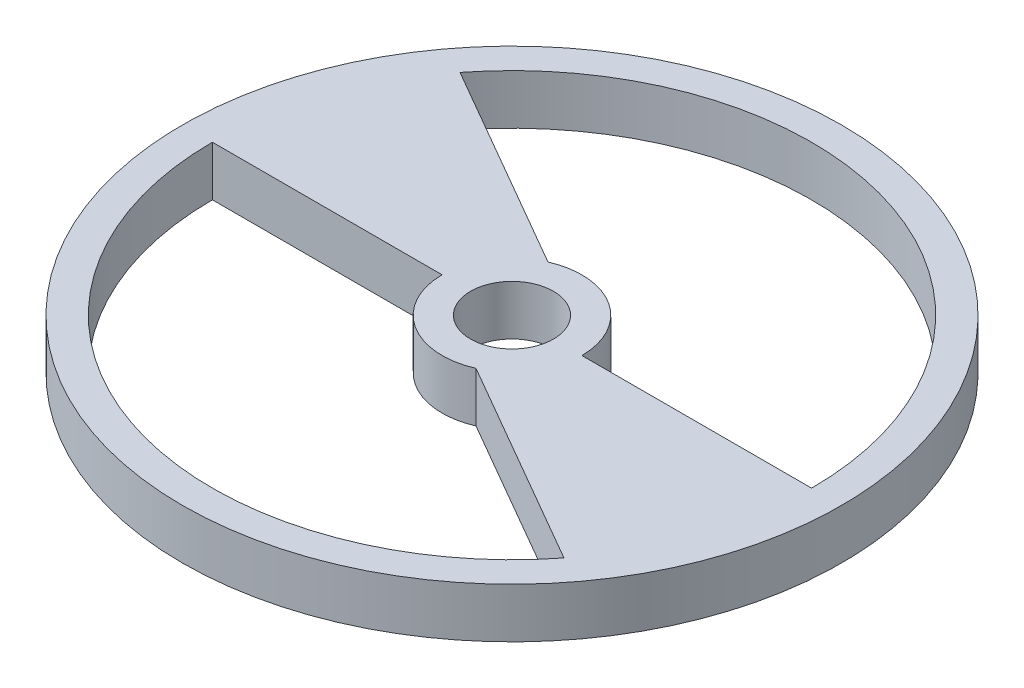
ISO-10303-21;
HEADER;
FILE_DESCRIPTION(('STEP AP214'),'2;1');
FILE_NAME('part.step','',(''),(''),'','','');
FILE_SCHEMA(('AUTOMOTIVE_DESIGN { 1 0 10303 214 1 1 1 1 }'));
ENDSEC;
DATA;
#1=APPLICATION_CONTEXT('core data for automotive mechanical design processes');
#2=APPLICATION_PROTOCOL_DEFINITION('international standard','automotive_design',2000,#1);
#3=PRODUCT_CONTEXT('',#1,'mechanical');
#4=PRODUCT('Part','Part','',(#3));
#5=PRODUCT_RELATED_PRODUCT_CATEGORY('part','',(#4));
#6=PRODUCT_DEFINITION_FORMATION('','',#4);
#7=PRODUCT_DEFINITION_CONTEXT('part definition',#1,'design');
#8=PRODUCT_DEFINITION('design','',#6,#7);
#9=PRODUCT_DEFINITION_SHAPE('','',#8);
#10=(LENGTH_UNIT() NAMED_UNIT(*) SI_UNIT(.MILLI.,.METRE.));
#11=(NAMED_UNIT(*) PLANE_ANGLE_UNIT() SI_UNIT($,.RADIAN.));
#12=(NAMED_UNIT(*) SI_UNIT($,.STERADIAN.) SOLID_ANGLE_UNIT());
#13=UNCERTAINTY_MEASURE_WITH_UNIT(LENGTH_MEASURE(1.E-05),#10,'distance_accuracy_value','');
#14=(GEOMETRIC_REPRESENTATION_CONTEXT(3) GLOBAL_UNCERTAINTY_ASSIGNED_CONTEXT((#13)) GLOBAL_UNIT_ASSIGNED_CONTEXT((#10,
#11,#12)) REPRESENTATION_CONTEXT('',''));
#15=CARTESIAN_POINT('',(0.,0.,0.));
#16=DIRECTION('',(0.,0.,1.));
#17=DIRECTION('',(1.,0.,0.));
#18=AXIS2_PLACEMENT_3D('',#15,#16,#17);
#19=CARTESIAN_POINT('',(0.,2.5,0.));
#20=DIRECTION('',(0.,1.,0.));
#21=DIRECTION('',(0.,0.,1.));
#22=AXIS2_PLACEMENT_3D('',#19,#20,#21);
#23=PLANE('',#22);
#24=CARTESIAN_POINT('',(0.,2.5,0.));
#25=DIRECTION('',(0.,1.,0.));
#26=DIRECTION('',(0.,0.,1.));
#27=AXIS2_PLACEMENT_3D('',#24,#25,#26);
#28=CIRCLE('',#27,16.5);
#29=CARTESIAN_POINT('',(0.,2.5,16.5));
#30=VERTEX_POINT('',#29);
#31=EDGE_CURVE('E11',#30,#30,#28,.T.);
#32=ORIENTED_EDGE('',*,*,#31,.T.);
#33=EDGE_LOOP('',(#32));
#34=FACE_BOUND('',#33,.T.);
#35=CARTESIAN_POINT('',(0.,2.5,0.));
#36=DIRECTION('',(0.,1.,0.));
#37=DIRECTION('',(0.,0.,1.));
#38=AXIS2_PLACEMENT_3D('',#35,#36,#37);
#39=CIRCLE('',#38,2.075);
#40=CARTESIAN_POINT('',(0.,2.5,2.075));
#41=VERTEX_POINT('',#40);
#42=EDGE_CURVE('E171',#41,#41,#39,.T.);
#43=ORIENTED_EDGE('',*,*,#42,.F.);
#44=EDGE_LOOP('',(#43));
#45=FACE_BOUND('',#44,.T.);
#46=DIRECTION('',(-1.,0.,0.));
#47=VECTOR('',#46,1.);
#48=CARTESIAN_POINT('',(-3.5,2.5,0.));
#49=LINE('',#48,#47);
#50=CARTESIAN_POINT('',(-3.5,2.5,0.));
#51=VERTEX_POINT('',#50);
#52=CARTESIAN_POINT('',(-15.,2.5,0.));
#53=VERTEX_POINT('',#52);
#54=EDGE_CURVE('E142',#51,#53,#49,.T.);
#55=ORIENTED_EDGE('',*,*,#54,.F.);
#56=CARTESIAN_POINT('',(0.,2.5,0.));
#57=DIRECTION('',(0.,-1.,0.));
#58=DIRECTION('',(0.,0.,1.));
#59=AXIS2_PLACEMENT_3D('',#56,#57,#58);
#60=CIRCLE('',#59,3.5);
#61=CARTESIAN_POINT('',(1.40345908404872,2.5,3.20629109710911));
#62=VERTEX_POINT('',#61);
#63=EDGE_CURVE('E140',#62,#51,#60,.T.);
#64=ORIENTED_EDGE('',*,*,#63,.F.);
#65=DIRECTION('',(-0.866025403784438,0.,-0.500000000000001));
#66=VECTOR('',#65,1.);
#67=CARTESIAN_POINT('',(1.40345908404872,2.5,3.20629109710911));
#68=LINE('',#67,#66);
#69=CARTESIAN_POINT('',(11.8279879911335,2.5,9.22489566778954));
#70=VERTEX_POINT('',#69);
#71=EDGE_CURVE('E148',#70,#62,#68,.T.);
#72=ORIENTED_EDGE('',*,*,#71,.F.);
#73=CARTESIAN_POINT('',(0.,2.5,0.));
#74=DIRECTION('',(0.,1.,0.));
#75=DIRECTION('',(0.,0.,1.));
#76=AXIS2_PLACEMENT_3D('',#73,#74,#75);
#77=CIRCLE('',#76,15.);
#78=EDGE_CURVE('E145',#53,#70,#77,.T.);
#79=ORIENTED_EDGE('',*,*,#78,.F.);
#80=EDGE_LOOP('',(#55,#64,#72,#79));
#81=FACE_BOUND('',#80,.T.);
#82=DIRECTION('',(0.866025403784442,0.,0.499999999999995));
#83=VECTOR('',#82,1.);
#84=CARTESIAN_POINT('',(-11.8279879911335,2.5,-9.22489566778945));
#85=LINE('',#84,#83);
#86=CARTESIAN_POINT('',(-11.8279879911335,2.5,-9.22489566778945));
#87=VERTEX_POINT('',#86);
#88=CARTESIAN_POINT('',(-1.40345908404875,2.5,-3.2062910971091));
#89=VERTEX_POINT('',#88);
#90=EDGE_CURVE('E112',#87,#89,#85,.T.);
#91=ORIENTED_EDGE('',*,*,#90,.F.);
#92=CARTESIAN_POINT('',(0.,2.5,0.));
#93=DIRECTION('',(0.,1.,0.));
#94=DIRECTION('',(0.,0.,1.));
#95=AXIS2_PLACEMENT_3D('',#92,#93,#94);
#96=CIRCLE('',#95,15.);
#97=CARTESIAN_POINT('',(15.,2.5,0.));
#98=VERTEX_POINT('',#97);
#99=EDGE_CURVE('E104',#98,#87,#96,.T.);
#100=ORIENTED_EDGE('',*,*,#99,.F.);
#101=DIRECTION('',(1.,0.,0.));
#102=VECTOR('',#101,1.);
#103=CARTESIAN_POINT('',(3.5,2.5,0.));
#104=LINE('',#103,#102);
#105=CARTESIAN_POINT('',(3.5,2.5,0.));
#106=VERTEX_POINT('',#105);
#107=EDGE_CURVE('E126',#106,#98,#104,.T.);
#108=ORIENTED_EDGE('',*,*,#107,.F.);
#109=CARTESIAN_POINT('',(0.,2.5,0.));
#110=DIRECTION('',(0.,-1.,0.));
#111=DIRECTION('',(0.,0.,1.));
#112=AXIS2_PLACEMENT_3D('',#109,#110,#111);
#113=CIRCLE('',#112,3.5);
#114=EDGE_CURVE('E124',#89,#106,#113,.T.);
#115=ORIENTED_EDGE('',*,*,#114,.F.);
#116=EDGE_LOOP('',(#91,#100,#108,#115));
#117=FACE_BOUND('',#116,.T.);
#118=ADVANCED_FACE('F39',(#34,#45,#81,#117),#23,.T.);
#119=CARTESIAN_POINT('',(0.,0.,0.));
#120=DIRECTION('',(0.,1.,0.));
#121=DIRECTION('',(0.,0.,1.));
#122=AXIS2_PLACEMENT_3D('',#119,#120,#121);
#123=PLANE('',#122);
#124=CARTESIAN_POINT('',(0.,0.,0.));
#125=DIRECTION('',(0.,-1.,0.));
#126=DIRECTION('',(0.,0.,1.));
#127=AXIS2_PLACEMENT_3D('',#124,#125,#126);
#128=CIRCLE('',#127,3.5);
#129=CARTESIAN_POINT('',(1.40345908404872,0.,3.20629109710911));
#130=VERTEX_POINT('',#129);
#131=CARTESIAN_POINT('',(-3.5,0.,0.));
#132=VERTEX_POINT('',#131);
#133=EDGE_CURVE('E120',#130,#132,#128,.T.);
#134=ORIENTED_EDGE('',*,*,#133,.T.);
#135=DIRECTION('',(-1.,0.,0.));
#136=VECTOR('',#135,1.);
#137=CARTESIAN_POINT('',(-3.5,0.,0.));
#138=LINE('',#137,#136);
#139=CARTESIAN_POINT('',(-15.,0.,0.));
#140=VERTEX_POINT('',#139);
#141=EDGE_CURVE('E153',#132,#140,#138,.T.);
#142=ORIENTED_EDGE('',*,*,#141,.T.);
#143=CARTESIAN_POINT('',(0.,0.,0.));
#144=DIRECTION('',(0.,1.,0.));
#145=DIRECTION('',(0.,0.,1.));
#146=AXIS2_PLACEMENT_3D('',#143,#144,#145);
#147=CIRCLE('',#146,15.);
#148=CARTESIAN_POINT('',(11.8279879911335,0.,9.22489566778954));
#149=VERTEX_POINT('',#148);
#150=EDGE_CURVE('E156',#140,#149,#147,.T.);
#151=ORIENTED_EDGE('',*,*,#150,.T.);
#152=DIRECTION('',(-0.866025403784438,0.,-0.500000000000001));
#153=VECTOR('',#152,1.);
#154=CARTESIAN_POINT('',(1.40345908404872,0.,3.20629109710911));
#155=LINE('',#154,#153);
#156=EDGE_CURVE('E143',#149,#130,#155,.T.);
#157=ORIENTED_EDGE('',*,*,#156,.T.);
#158=EDGE_LOOP('',(#134,#142,#151,#157));
#159=FACE_BOUND('',#158,.T.);
#160=CARTESIAN_POINT('',(0.,0.,0.));
#161=DIRECTION('',(0.,1.,0.));
#162=DIRECTION('',(0.,0.,1.));
#163=AXIS2_PLACEMENT_3D('',#160,#161,#162);
#164=CIRCLE('',#163,16.5);
#165=CARTESIAN_POINT('',(0.,0.,16.5));
#166=VERTEX_POINT('',#165);
#167=EDGE_CURVE('E43',#166,#166,#164,.T.);
#168=ORIENTED_EDGE('',*,*,#167,.F.);
#169=EDGE_LOOP('',(#168));
#170=FACE_BOUND('',#169,.T.);
#171=CARTESIAN_POINT('',(0.,0.,0.));
#172=DIRECTION('',(0.,1.,0.));
#173=DIRECTION('',(0.,0.,1.));
#174=AXIS2_PLACEMENT_3D('',#171,#172,#173);
#175=CIRCLE('',#174,2.075);
#176=CARTESIAN_POINT('',(0.,0.,2.075));
#177=VERTEX_POINT('',#176);
#178=EDGE_CURVE('E170',#177,#177,#175,.T.);
#179=ORIENTED_EDGE('',*,*,#178,.T.);
#180=EDGE_LOOP('',(#179));
#181=FACE_BOUND('',#180,.T.);
#182=CARTESIAN_POINT('',(0.,0.,0.));
#183=DIRECTION('',(0.,1.,0.));
#184=DIRECTION('',(0.,0.,1.));
#185=AXIS2_PLACEMENT_3D('',#182,#183,#184);
#186=CIRCLE('',#185,15.);
#187=CARTESIAN_POINT('',(15.,0.,0.));
#188=VERTEX_POINT('',#187);
#189=CARTESIAN_POINT('',(-11.8279879911335,0.,-9.22489566778945));
#190=VERTEX_POINT('',#189);
#191=EDGE_CURVE('E62',#188,#190,#186,.T.);
#192=ORIENTED_EDGE('',*,*,#191,.T.);
#193=DIRECTION('',(0.866025403784442,0.,0.499999999999995));
#194=VECTOR('',#193,1.);
#195=CARTESIAN_POINT('',(-11.8279879911335,0.,-9.22489566778945));
#196=LINE('',#195,#194);
#197=CARTESIAN_POINT('',(-1.40345908404875,0.,-3.2062910971091));
#198=VERTEX_POINT('',#197);
#199=EDGE_CURVE('E119',#190,#198,#196,.T.);
#200=ORIENTED_EDGE('',*,*,#199,.T.);
#201=CARTESIAN_POINT('',(0.,0.,0.));
#202=DIRECTION('',(0.,-1.,0.));
#203=DIRECTION('',(0.,0.,1.));
#204=AXIS2_PLACEMENT_3D('',#201,#202,#203);
#205=CIRCLE('',#204,3.5);
#206=CARTESIAN_POINT('',(3.5,0.,0.));
#207=VERTEX_POINT('',#206);
#208=EDGE_CURVE('E132',#198,#207,#205,.T.);
#209=ORIENTED_EDGE('',*,*,#208,.T.);
#210=DIRECTION('',(1.,0.,0.));
#211=VECTOR('',#210,1.);
#212=CARTESIAN_POINT('',(3.5,0.,0.));
#213=LINE('',#212,#211);
#214=EDGE_CURVE('E113',#207,#188,#213,.T.);
#215=ORIENTED_EDGE('',*,*,#214,.T.);
#216=EDGE_LOOP('',(#192,#200,#209,#215));
#217=FACE_BOUND('',#216,.T.);
#218=ADVANCED_FACE('F177',(#159,#170,#181,#217),#123,.F.);
#219=CARTESIAN_POINT('',(0.,2.5,0.));
#220=DIRECTION('',(0.,-1.,0.));
#221=DIRECTION('',(0.,0.,-1.));
#222=AXIS2_PLACEMENT_3D('',#219,#220,#221);
#223=CYLINDRICAL_SURFACE('',#222,16.5);
#224=ORIENTED_EDGE('',*,*,#31,.F.);
#225=EDGE_LOOP('',(#224));
#226=FACE_BOUND('',#225,.T.);
#227=ORIENTED_EDGE('',*,*,#167,.T.);
#228=EDGE_LOOP('',(#227));
#229=FACE_BOUND('',#228,.T.);
#230=ADVANCED_FACE('F41',(#226,#229),#223,.T.);
#231=CARTESIAN_POINT('',(0.,2.5,0.));
#232=DIRECTION('',(0.,-1.,0.));
#233=DIRECTION('',(0.,0.,-1.));
#234=AXIS2_PLACEMENT_3D('',#231,#232,#233);
#235=CYLINDRICAL_SURFACE('',#234,2.075);
#236=ORIENTED_EDGE('',*,*,#42,.T.);
#237=EDGE_LOOP('',(#236));
#238=FACE_BOUND('',#237,.T.);
#239=ORIENTED_EDGE('',*,*,#178,.F.);
#240=EDGE_LOOP('',(#239));
#241=FACE_BOUND('',#240,.T.);
#242=ADVANCED_FACE('F180',(#238,#241),#235,.F.);
#243=CARTESIAN_POINT('',(0.,2.5,0.));
#244=DIRECTION('',(0.,-1.,0.));
#245=DIRECTION('',(0.,0.,-1.));
#246=AXIS2_PLACEMENT_3D('',#243,#244,#245);
#247=CYLINDRICAL_SURFACE('',#246,3.5);
#248=ORIENTED_EDGE('',*,*,#133,.F.);
#249=DIRECTION('',(0.,-1.,0.));
#250=VECTOR('',#249,1.);
#251=CARTESIAN_POINT('',(1.40345908404872,2.5,3.20629109710911));
#252=LINE('',#251,#250);
#253=EDGE_CURVE('E150',#62,#130,#252,.T.);
#254=ORIENTED_EDGE('',*,*,#253,.F.);
#255=ORIENTED_EDGE('',*,*,#63,.T.);
#256=DIRECTION('',(0.,-1.,0.));
#257=VECTOR('',#256,1.);
#258=CARTESIAN_POINT('',(-3.5,2.5,0.));
#259=LINE('',#258,#257);
#260=EDGE_CURVE('E167',#51,#132,#259,.T.);
#261=ORIENTED_EDGE('',*,*,#260,.T.);
#262=EDGE_LOOP('',(#248,#254,#255,#261));
#263=FACE_BOUND('',#262,.T.);
#264=ADVANCED_FACE('F182',(#263),#247,.T.);
#265=CARTESIAN_POINT('',(-3.5,2.5,0.));
#266=DIRECTION('',(0.,0.,1.));
#267=DIRECTION('',(1.,0.,0.));
#268=AXIS2_PLACEMENT_3D('',#265,#266,#267);
#269=PLANE('',#268);
#270=ORIENTED_EDGE('',*,*,#141,.F.);
#271=ORIENTED_EDGE('',*,*,#260,.F.);
#272=ORIENTED_EDGE('',*,*,#54,.T.);
#273=DIRECTION('',(0.,-1.,0.));
#274=VECTOR('',#273,1.);
#275=CARTESIAN_POINT('',(-15.,2.5,0.));
#276=LINE('',#275,#274);
#277=EDGE_CURVE('E165',#53,#140,#276,.T.);
#278=ORIENTED_EDGE('',*,*,#277,.T.);
#279=EDGE_LOOP('',(#270,#271,#272,#278));
#280=FACE_BOUND('',#279,.T.);
#281=ADVANCED_FACE('F189',(#280),#269,.T.);
#282=CARTESIAN_POINT('',(0.,2.5,0.));
#283=DIRECTION('',(0.,-1.,0.));
#284=DIRECTION('',(0.,0.,-1.));
#285=AXIS2_PLACEMENT_3D('',#282,#283,#284);
#286=CYLINDRICAL_SURFACE('',#285,15.);
#287=ORIENTED_EDGE('',*,*,#150,.F.);
#288=ORIENTED_EDGE('',*,*,#277,.F.);
#289=ORIENTED_EDGE('',*,*,#78,.T.);
#290=DIRECTION('',(0.,-1.,0.));
#291=VECTOR('',#290,1.);
#292=CARTESIAN_POINT('',(11.8279879911335,2.5,9.22489566778954));
#293=LINE('',#292,#291);
#294=EDGE_CURVE('E163',#70,#149,#293,.T.);
#295=ORIENTED_EDGE('',*,*,#294,.T.);
#296=EDGE_LOOP('',(#287,#288,#289,#295));
#297=FACE_BOUND('',#296,.T.);
#298=ADVANCED_FACE('F213',(#297),#286,.F.);
#299=CARTESIAN_POINT('',(1.40345908404872,2.5,3.20629109710911));
#300=DIRECTION('',(-0.500000000000001,0.,0.866025403784438));
#301=DIRECTION('',(0.866025403784438,0.,0.500000000000001));
#302=AXIS2_PLACEMENT_3D('',#299,#300,#301);
#303=PLANE('',#302);
#304=ORIENTED_EDGE('',*,*,#156,.F.);
#305=ORIENTED_EDGE('',*,*,#294,.F.);
#306=ORIENTED_EDGE('',*,*,#71,.T.);
#307=ORIENTED_EDGE('',*,*,#253,.T.);
#308=EDGE_LOOP('',(#304,#305,#306,#307));
#309=FACE_BOUND('',#308,.T.);
#310=ADVANCED_FACE('F218',(#309),#303,.T.);
#311=CARTESIAN_POINT('',(0.,2.5,0.));
#312=DIRECTION('',(0.,-1.,0.));
#313=DIRECTION('',(0.,0.,-1.));
#314=AXIS2_PLACEMENT_3D('',#311,#312,#313);
#315=CYLINDRICAL_SURFACE('',#314,15.);
#316=ORIENTED_EDGE('',*,*,#191,.F.);
#317=DIRECTION('',(0.,-1.,0.));
#318=VECTOR('',#317,1.);
#319=CARTESIAN_POINT('',(15.,2.5,0.));
#320=LINE('',#319,#318);
#321=EDGE_CURVE('E108',#98,#188,#320,.T.);
#322=ORIENTED_EDGE('',*,*,#321,.F.);
#323=ORIENTED_EDGE('',*,*,#99,.T.);
#324=DIRECTION('',(0.,-1.,0.));
#325=VECTOR('',#324,1.);
#326=CARTESIAN_POINT('',(-11.8279879911335,2.5,-9.22489566778945));
#327=LINE('',#326,#325);
#328=EDGE_CURVE('E107',#87,#190,#327,.T.);
#329=ORIENTED_EDGE('',*,*,#328,.T.);
#330=EDGE_LOOP('',(#316,#322,#323,#329));
#331=FACE_BOUND('',#330,.T.);
#332=ADVANCED_FACE('F106',(#331),#315,.F.);
#333=CARTESIAN_POINT('',(-11.8279879911335,2.5,-9.22489566778945));
#334=DIRECTION('',(0.499999999999995,0.,-0.866025403784442));
#335=DIRECTION('',(-0.866025403784442,0.,-0.499999999999995));
#336=AXIS2_PLACEMENT_3D('',#333,#334,#335);
#337=PLANE('',#336);
#338=ORIENTED_EDGE('',*,*,#199,.F.);
#339=ORIENTED_EDGE('',*,*,#328,.F.);
#340=ORIENTED_EDGE('',*,*,#90,.T.);
#341=DIRECTION('',(0.,-1.,0.));
#342=VECTOR('',#341,1.);
#343=CARTESIAN_POINT('',(-1.40345908404875,2.5,-3.2062910971091));
#344=LINE('',#343,#342);
#345=EDGE_CURVE('E121',#89,#198,#344,.T.);
#346=ORIENTED_EDGE('',*,*,#345,.T.);
#347=EDGE_LOOP('',(#338,#339,#340,#346));
#348=FACE_BOUND('',#347,.T.);
#349=ADVANCED_FACE('F116',(#348),#337,.T.);
#350=CARTESIAN_POINT('',(0.,2.5,0.));
#351=DIRECTION('',(0.,-1.,0.));
#352=DIRECTION('',(0.,0.,-1.));
#353=AXIS2_PLACEMENT_3D('',#350,#351,#352);
#354=CYLINDRICAL_SURFACE('',#353,3.5);
#355=ORIENTED_EDGE('',*,*,#208,.F.);
#356=ORIENTED_EDGE('',*,*,#345,.F.);
#357=ORIENTED_EDGE('',*,*,#114,.T.);
#358=DIRECTION('',(0.,-1.,0.));
#359=VECTOR('',#358,1.);
#360=CARTESIAN_POINT('',(3.5,2.5,0.));
#361=LINE('',#360,#359);
#362=EDGE_CURVE('E54',#106,#207,#361,.T.);
#363=ORIENTED_EDGE('',*,*,#362,.T.);
#364=EDGE_LOOP('',(#355,#356,#357,#363));
#365=FACE_BOUND('',#364,.T.);
#366=ADVANCED_FACE('F259',(#365),#354,.T.);
#367=CARTESIAN_POINT('',(3.5,2.5,0.));
#368=DIRECTION('',(0.,0.,-1.));
#369=DIRECTION('',(-1.,0.,0.));
#370=AXIS2_PLACEMENT_3D('',#367,#368,#369);
#371=PLANE('',#370);
#372=ORIENTED_EDGE('',*,*,#214,.F.);
#373=ORIENTED_EDGE('',*,*,#362,.F.);
#374=ORIENTED_EDGE('',*,*,#107,.T.);
#375=ORIENTED_EDGE('',*,*,#321,.T.);
#376=EDGE_LOOP('',(#372,#373,#374,#375));
#377=FACE_BOUND('',#376,.T.);
#378=ADVANCED_FACE('F267',(#377),#371,.T.);
#379=CLOSED_SHELL('',(#118,#218,#230,#242,#264,#281,#298,#310,#332,#349,#366,#378));
#380=MANIFOLD_SOLID_BREP('B2',#379);
#381=ADVANCED_BREP_SHAPE_REPRESENTATION('',(#18,#380),#14);
#382=SHAPE_DEFINITION_REPRESENTATION(#9,#381);
ENDSEC;
END-ISO-10303-21;
